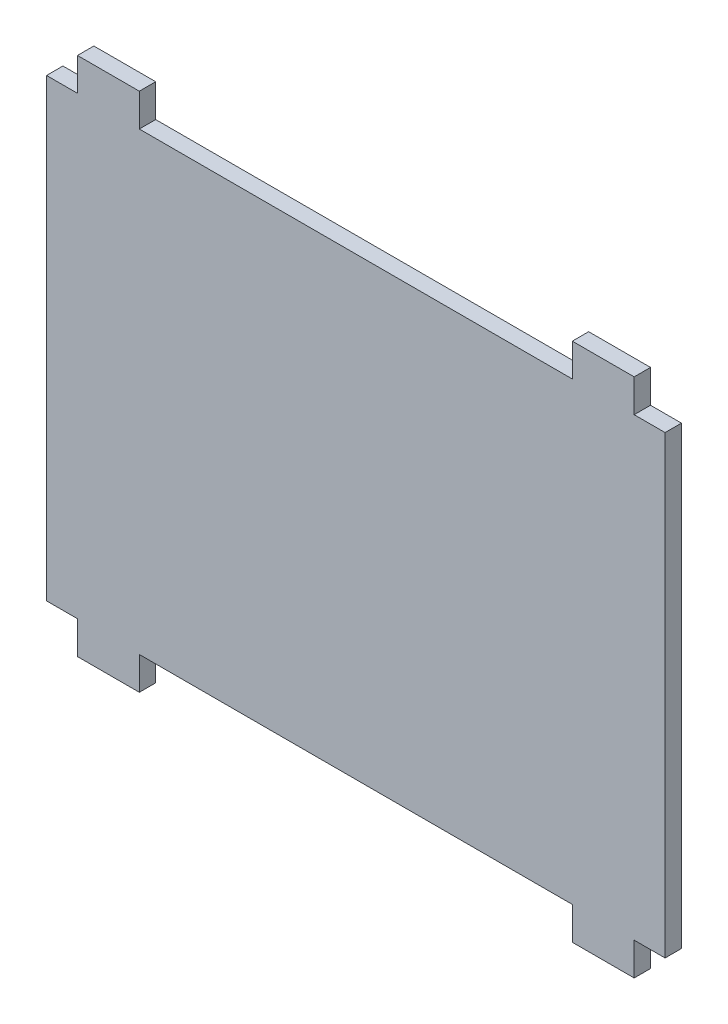
ISO-10303-21;
HEADER;
FILE_DESCRIPTION(('STEP AP214'),'2;1');
FILE_NAME('part.step','',(''),(''),'','','');
FILE_SCHEMA(('AUTOMOTIVE_DESIGN { 1 0 10303 214 1 1 1 1 }'));
ENDSEC;
DATA;
#1=APPLICATION_CONTEXT('core data for automotive mechanical design processes');
#2=APPLICATION_PROTOCOL_DEFINITION('international standard','automotive_design',2000,#1);
#3=PRODUCT_CONTEXT('',#1,'mechanical');
#4=PRODUCT('Part','Part','',(#3));
#5=PRODUCT_RELATED_PRODUCT_CATEGORY('part','',(#4));
#6=PRODUCT_DEFINITION_FORMATION('','',#4);
#7=PRODUCT_DEFINITION_CONTEXT('part definition',#1,'design');
#8=PRODUCT_DEFINITION('design','',#6,#7);
#9=PRODUCT_DEFINITION_SHAPE('','',#8);
#10=(LENGTH_UNIT() NAMED_UNIT(*) SI_UNIT(.MILLI.,.METRE.));
#11=(NAMED_UNIT(*) PLANE_ANGLE_UNIT() SI_UNIT($,.RADIAN.));
#12=(NAMED_UNIT(*) SI_UNIT($,.STERADIAN.) SOLID_ANGLE_UNIT());
#13=UNCERTAINTY_MEASURE_WITH_UNIT(LENGTH_MEASURE(1.E-05),#10,'distance_accuracy_value','');
#14=(GEOMETRIC_REPRESENTATION_CONTEXT(3) GLOBAL_UNCERTAINTY_ASSIGNED_CONTEXT((#13)) GLOBAL_UNIT_ASSIGNED_CONTEXT((#10,
#11,#12)) REPRESENTATION_CONTEXT('',''));
#15=CARTESIAN_POINT('',(0.,0.,0.));
#16=DIRECTION('',(0.,0.,1.));
#17=DIRECTION('',(1.,0.,0.));
#18=AXIS2_PLACEMENT_3D('',#15,#16,#17);
#19=CARTESIAN_POINT('',(-30.,0.,1.5875));
#20=DIRECTION('',(1.,0.,0.));
#21=DIRECTION('',(0.,0.,-1.));
#22=AXIS2_PLACEMENT_3D('',#19,#20,#21);
#23=PLANE('',#22);
#24=DIRECTION('',(0.,0.,-1.));
#25=VECTOR('',#24,1.);
#26=CARTESIAN_POINT('',(-30.,-22.07,1.5875));
#27=LINE('',#26,#25);
#28=CARTESIAN_POINT('',(-30.,-22.07,1.5875));
#29=VERTEX_POINT('',#28);
#30=CARTESIAN_POINT('',(-30.,-22.07,0.));
#31=VERTEX_POINT('',#30);
#32=EDGE_CURVE('E237',#29,#31,#27,.T.);
#33=ORIENTED_EDGE('',*,*,#32,.F.);
#34=DIRECTION('',(0.,-1.,0.));
#35=VECTOR('',#34,1.);
#36=CARTESIAN_POINT('',(-30.,0.,1.5875));
#37=LINE('',#36,#35);
#38=CARTESIAN_POINT('',(-30.,22.07,1.5875));
#39=VERTEX_POINT('',#38);
#40=EDGE_CURVE('E308',#39,#29,#37,.T.);
#41=ORIENTED_EDGE('',*,*,#40,.F.);
#42=DIRECTION('',(0.,0.,-1.));
#43=VECTOR('',#42,1.);
#44=CARTESIAN_POINT('',(-30.,22.07,1.5875));
#45=LINE('',#44,#43);
#46=CARTESIAN_POINT('',(-30.,22.07,0.));
#47=VERTEX_POINT('',#46);
#48=EDGE_CURVE('E304',#39,#47,#45,.T.);
#49=ORIENTED_EDGE('',*,*,#48,.T.);
#50=DIRECTION('',(0.,-1.,0.));
#51=VECTOR('',#50,1.);
#52=CARTESIAN_POINT('',(-30.,0.,0.));
#53=LINE('',#52,#51);
#54=EDGE_CURVE('E307',#47,#31,#53,.T.);
#55=ORIENTED_EDGE('',*,*,#54,.T.);
#56=EDGE_LOOP('',(#33,#41,#49,#55));
#57=FACE_BOUND('',#56,.T.);
#58=ADVANCED_FACE('F37',(#57),#23,.F.);
#59=CARTESIAN_POINT('',(30.,0.,1.5875));
#60=DIRECTION('',(-1.,0.,0.));
#61=DIRECTION('',(0.,0.,1.));
#62=AXIS2_PLACEMENT_3D('',#59,#60,#61);
#63=PLANE('',#62);
#64=DIRECTION('',(0.,0.,1.));
#65=VECTOR('',#64,1.);
#66=CARTESIAN_POINT('',(30.,-22.07,1.5875));
#67=LINE('',#66,#65);
#68=CARTESIAN_POINT('',(30.,-22.07,0.));
#69=VERTEX_POINT('',#68);
#70=CARTESIAN_POINT('',(30.,-22.07,1.5875));
#71=VERTEX_POINT('',#70);
#72=EDGE_CURVE('E230',#69,#71,#67,.T.);
#73=ORIENTED_EDGE('',*,*,#72,.F.);
#74=DIRECTION('',(0.,1.,0.));
#75=VECTOR('',#74,1.);
#76=CARTESIAN_POINT('',(30.,0.,0.));
#77=LINE('',#76,#75);
#78=CARTESIAN_POINT('',(30.,22.07,0.));
#79=VERTEX_POINT('',#78);
#80=EDGE_CURVE('E192',#69,#79,#77,.T.);
#81=ORIENTED_EDGE('',*,*,#80,.T.);
#82=DIRECTION('',(0.,0.,1.));
#83=VECTOR('',#82,1.);
#84=CARTESIAN_POINT('',(30.,22.07,1.5875));
#85=LINE('',#84,#83);
#86=CARTESIAN_POINT('',(30.,22.07,1.5875));
#87=VERTEX_POINT('',#86);
#88=EDGE_CURVE('E295',#79,#87,#85,.T.);
#89=ORIENTED_EDGE('',*,*,#88,.T.);
#90=DIRECTION('',(0.,1.,0.));
#91=VECTOR('',#90,1.);
#92=CARTESIAN_POINT('',(30.,0.,1.5875));
#93=LINE('',#92,#91);
#94=EDGE_CURVE('E311',#71,#87,#93,.T.);
#95=ORIENTED_EDGE('',*,*,#94,.F.);
#96=EDGE_LOOP('',(#73,#81,#89,#95));
#97=FACE_BOUND('',#96,.T.);
#98=ADVANCED_FACE('F350',(#97),#63,.F.);
#99=CARTESIAN_POINT('',(0.,0.,1.5875));
#100=DIRECTION('',(0.,0.,-1.));
#101=DIRECTION('',(-1.,0.,0.));
#102=AXIS2_PLACEMENT_3D('',#99,#100,#101);
#103=PLANE('',#102);
#104=DIRECTION('',(1.,0.,0.));
#105=VECTOR('',#104,1.);
#106=CARTESIAN_POINT('',(-32.8,-22.07,1.5875));
#107=LINE('',#106,#105);
#108=CARTESIAN_POINT('',(-27.,-22.07,1.5875));
#109=VERTEX_POINT('',#108);
#110=EDGE_CURVE('E206',#29,#109,#107,.T.);
#111=ORIENTED_EDGE('',*,*,#110,.T.);
#112=DIRECTION('',(0.,-1.,0.));
#113=VECTOR('',#112,1.);
#114=CARTESIAN_POINT('',(-27.,-25.25,1.5875));
#115=LINE('',#114,#113);
#116=CARTESIAN_POINT('',(-27.,-25.25,1.5875));
#117=VERTEX_POINT('',#116);
#118=EDGE_CURVE('E203',#109,#117,#115,.T.);
#119=ORIENTED_EDGE('',*,*,#118,.T.);
#120=DIRECTION('',(-1.,0.,0.));
#121=VECTOR('',#120,1.);
#122=CARTESIAN_POINT('',(-30.,-25.25,1.5875));
#123=LINE('',#122,#121);
#124=CARTESIAN_POINT('',(-21.,-25.25,1.5875));
#125=VERTEX_POINT('',#124);
#126=EDGE_CURVE('E240',#125,#117,#123,.T.);
#127=ORIENTED_EDGE('',*,*,#126,.F.);
#128=DIRECTION('',(0.,1.,0.));
#129=VECTOR('',#128,1.);
#130=CARTESIAN_POINT('',(-21.,-25.25,1.5875));
#131=LINE('',#130,#129);
#132=CARTESIAN_POINT('',(-21.,-22.07,1.5875));
#133=VERTEX_POINT('',#132);
#134=EDGE_CURVE('E51',#125,#133,#131,.T.);
#135=ORIENTED_EDGE('',*,*,#134,.T.);
#136=DIRECTION('',(1.,0.,0.));
#137=VECTOR('',#136,1.);
#138=CARTESIAN_POINT('',(-21.,-22.07,1.5875));
#139=LINE('',#138,#137);
#140=CARTESIAN_POINT('',(21.,-22.07,1.5875));
#141=VERTEX_POINT('',#140);
#142=EDGE_CURVE('E198',#133,#141,#139,.T.);
#143=ORIENTED_EDGE('',*,*,#142,.T.);
#144=DIRECTION('',(0.,-1.,0.));
#145=VECTOR('',#144,1.);
#146=CARTESIAN_POINT('',(21.,-25.25,1.5875));
#147=LINE('',#146,#145);
#148=CARTESIAN_POINT('',(21.,-25.25,1.5875));
#149=VERTEX_POINT('',#148);
#150=EDGE_CURVE('E217',#141,#149,#147,.T.);
#151=ORIENTED_EDGE('',*,*,#150,.T.);
#152=CARTESIAN_POINT('',(27.,-25.25,1.5875));
#153=VERTEX_POINT('',#152);
#154=EDGE_CURVE('E243',#153,#149,#123,.T.);
#155=ORIENTED_EDGE('',*,*,#154,.F.);
#156=DIRECTION('',(0.,1.,0.));
#157=VECTOR('',#156,1.);
#158=CARTESIAN_POINT('',(27.,-25.25,1.5875));
#159=LINE('',#158,#157);
#160=CARTESIAN_POINT('',(27.,-22.07,1.5875));
#161=VERTEX_POINT('',#160);
#162=EDGE_CURVE('E59',#153,#161,#159,.T.);
#163=ORIENTED_EDGE('',*,*,#162,.T.);
#164=DIRECTION('',(1.,0.,0.));
#165=VECTOR('',#164,1.);
#166=CARTESIAN_POINT('',(27.,-22.07,1.5875));
#167=LINE('',#166,#165);
#168=EDGE_CURVE('E186',#161,#71,#167,.T.);
#169=ORIENTED_EDGE('',*,*,#168,.T.);
#170=ORIENTED_EDGE('',*,*,#94,.T.);
#171=DIRECTION('',(1.,0.,0.));
#172=VECTOR('',#171,1.);
#173=CARTESIAN_POINT('',(27.,22.07,1.5875));
#174=LINE('',#173,#172);
#175=CARTESIAN_POINT('',(27.,22.07,1.5875));
#176=VERTEX_POINT('',#175);
#177=EDGE_CURVE('E254',#176,#87,#174,.T.);
#178=ORIENTED_EDGE('',*,*,#177,.F.);
#179=DIRECTION('',(0.,-1.,0.));
#180=VECTOR('',#179,1.);
#181=CARTESIAN_POINT('',(27.,25.25,1.5875));
#182=LINE('',#181,#180);
#183=CARTESIAN_POINT('',(27.,25.25,1.5875));
#184=VERTEX_POINT('',#183);
#185=EDGE_CURVE('E250',#184,#176,#182,.T.);
#186=ORIENTED_EDGE('',*,*,#185,.F.);
#187=DIRECTION('',(-1.,0.,0.));
#188=VECTOR('',#187,1.);
#189=CARTESIAN_POINT('',(-30.,25.25,1.5875));
#190=LINE('',#189,#188);
#191=CARTESIAN_POINT('',(21.,25.25,1.5875));
#192=VERTEX_POINT('',#191);
#193=EDGE_CURVE('E44',#184,#192,#190,.T.);
#194=ORIENTED_EDGE('',*,*,#193,.T.);
#195=DIRECTION('',(0.,1.,0.));
#196=VECTOR('',#195,1.);
#197=CARTESIAN_POINT('',(21.,25.25,1.5875));
#198=LINE('',#197,#196);
#199=CARTESIAN_POINT('',(21.,22.07,1.5875));
#200=VERTEX_POINT('',#199);
#201=EDGE_CURVE('E289',#200,#192,#198,.T.);
#202=ORIENTED_EDGE('',*,*,#201,.F.);
#203=DIRECTION('',(1.,0.,0.));
#204=VECTOR('',#203,1.);
#205=CARTESIAN_POINT('',(-21.,22.07,1.5875));
#206=LINE('',#205,#204);
#207=CARTESIAN_POINT('',(-21.,22.07,1.5875));
#208=VERTEX_POINT('',#207);
#209=EDGE_CURVE('E262',#208,#200,#206,.T.);
#210=ORIENTED_EDGE('',*,*,#209,.F.);
#211=DIRECTION('',(0.,-1.,0.));
#212=VECTOR('',#211,1.);
#213=CARTESIAN_POINT('',(-21.,25.25,1.5875));
#214=LINE('',#213,#212);
#215=CARTESIAN_POINT('',(-21.,25.25,1.5875));
#216=VERTEX_POINT('',#215);
#217=EDGE_CURVE('E280',#216,#208,#214,.T.);
#218=ORIENTED_EDGE('',*,*,#217,.F.);
#219=CARTESIAN_POINT('',(-27.,25.25,1.5875));
#220=VERTEX_POINT('',#219);
#221=EDGE_CURVE('E314',#216,#220,#190,.T.);
#222=ORIENTED_EDGE('',*,*,#221,.T.);
#223=DIRECTION('',(0.,1.,0.));
#224=VECTOR('',#223,1.);
#225=CARTESIAN_POINT('',(-27.,25.25,1.5875));
#226=LINE('',#225,#224);
#227=CARTESIAN_POINT('',(-27.,22.07,1.5875));
#228=VERTEX_POINT('',#227);
#229=EDGE_CURVE('E268',#228,#220,#226,.T.);
#230=ORIENTED_EDGE('',*,*,#229,.F.);
#231=DIRECTION('',(1.,0.,0.));
#232=VECTOR('',#231,1.);
#233=CARTESIAN_POINT('',(-32.8,22.07,1.5875));
#234=LINE('',#233,#232);
#235=EDGE_CURVE('E269',#39,#228,#234,.T.);
#236=ORIENTED_EDGE('',*,*,#235,.F.);
#237=ORIENTED_EDGE('',*,*,#40,.T.);
#238=EDGE_LOOP('',(#111,#119,#127,#135,#143,#151,#155,#163,#169,#170,#178,#186,#194,#202,#210,
#218,#222,#230,#236,#237));
#239=FACE_BOUND('',#238,.T.);
#240=ADVANCED_FACE('F338',(#239),#103,.F.);
#241=CARTESIAN_POINT('',(0.,0.,0.));
#242=DIRECTION('',(0.,0.,-1.));
#243=DIRECTION('',(-1.,0.,0.));
#244=AXIS2_PLACEMENT_3D('',#241,#242,#243);
#245=PLANE('',#244);
#246=DIRECTION('',(0.,-1.,0.));
#247=VECTOR('',#246,1.);
#248=CARTESIAN_POINT('',(-27.,-25.25,0.));
#249=LINE('',#248,#247);
#250=CARTESIAN_POINT('',(-27.,-22.07,0.));
#251=VERTEX_POINT('',#250);
#252=CARTESIAN_POINT('',(-27.,-25.25,0.));
#253=VERTEX_POINT('',#252);
#254=EDGE_CURVE('E202',#251,#253,#249,.T.);
#255=ORIENTED_EDGE('',*,*,#254,.F.);
#256=DIRECTION('',(1.,0.,0.));
#257=VECTOR('',#256,1.);
#258=CARTESIAN_POINT('',(-32.8,-22.07,0.));
#259=LINE('',#258,#257);
#260=EDGE_CURVE('E200',#31,#251,#259,.T.);
#261=ORIENTED_EDGE('',*,*,#260,.F.);
#262=ORIENTED_EDGE('',*,*,#54,.F.);
#263=DIRECTION('',(-1.,0.,0.));
#264=VECTOR('',#263,1.);
#265=CARTESIAN_POINT('',(0.,22.07,0.));
#266=LINE('',#265,#264);
#267=CARTESIAN_POINT('',(-27.,22.07,0.));
#268=VERTEX_POINT('',#267);
#269=EDGE_CURVE('E11',#268,#47,#266,.T.);
#270=ORIENTED_EDGE('',*,*,#269,.F.);
#271=DIRECTION('',(0.,1.,0.));
#272=VECTOR('',#271,1.);
#273=CARTESIAN_POINT('',(-27.,25.25,0.));
#274=LINE('',#273,#272);
#275=CARTESIAN_POINT('',(-27.,25.25,0.));
#276=VERTEX_POINT('',#275);
#277=EDGE_CURVE('E264',#268,#276,#274,.T.);
#278=ORIENTED_EDGE('',*,*,#277,.T.);
#279=DIRECTION('',(-1.,0.,0.));
#280=VECTOR('',#279,1.);
#281=CARTESIAN_POINT('',(-30.,25.25,0.));
#282=LINE('',#281,#280);
#283=CARTESIAN_POINT('',(-21.,25.25,0.));
#284=VERTEX_POINT('',#283);
#285=EDGE_CURVE('E319',#284,#276,#282,.T.);
#286=ORIENTED_EDGE('',*,*,#285,.F.);
#287=DIRECTION('',(0.,-1.,0.));
#288=VECTOR('',#287,1.);
#289=CARTESIAN_POINT('',(-21.,25.25,0.));
#290=LINE('',#289,#288);
#291=CARTESIAN_POINT('',(-21.,22.07,0.));
#292=VERTEX_POINT('',#291);
#293=EDGE_CURVE('E283',#284,#292,#290,.T.);
#294=ORIENTED_EDGE('',*,*,#293,.T.);
#295=DIRECTION('',(1.,0.,0.));
#296=VECTOR('',#295,1.);
#297=CARTESIAN_POINT('',(-21.,22.07,0.));
#298=LINE('',#297,#296);
#299=CARTESIAN_POINT('',(21.,22.07,0.));
#300=VERTEX_POINT('',#299);
#301=EDGE_CURVE('E276',#292,#300,#298,.T.);
#302=ORIENTED_EDGE('',*,*,#301,.T.);
#303=DIRECTION('',(0.,1.,0.));
#304=VECTOR('',#303,1.);
#305=CARTESIAN_POINT('',(21.,25.25,0.));
#306=LINE('',#305,#304);
#307=CARTESIAN_POINT('',(21.,25.25,0.));
#308=VERTEX_POINT('',#307);
#309=EDGE_CURVE('E279',#300,#308,#306,.T.);
#310=ORIENTED_EDGE('',*,*,#309,.T.);
#311=CARTESIAN_POINT('',(27.,25.25,0.));
#312=VERTEX_POINT('',#311);
#313=EDGE_CURVE('E312',#312,#308,#282,.T.);
#314=ORIENTED_EDGE('',*,*,#313,.F.);
#315=DIRECTION('',(0.,-1.,0.));
#316=VECTOR('',#315,1.);
#317=CARTESIAN_POINT('',(27.,25.25,0.));
#318=LINE('',#317,#316);
#319=CARTESIAN_POINT('',(27.,22.07,0.));
#320=VERTEX_POINT('',#319);
#321=EDGE_CURVE('E249',#312,#320,#318,.T.);
#322=ORIENTED_EDGE('',*,*,#321,.T.);
#323=DIRECTION('',(1.,0.,0.));
#324=VECTOR('',#323,1.);
#325=CARTESIAN_POINT('',(27.,22.07,0.));
#326=LINE('',#325,#324);
#327=EDGE_CURVE('E247',#320,#79,#326,.T.);
#328=ORIENTED_EDGE('',*,*,#327,.T.);
#329=ORIENTED_EDGE('',*,*,#80,.F.);
#330=DIRECTION('',(1.,0.,0.));
#331=VECTOR('',#330,1.);
#332=CARTESIAN_POINT('',(27.,-22.07,0.));
#333=LINE('',#332,#331);
#334=CARTESIAN_POINT('',(27.,-22.07,0.));
#335=VERTEX_POINT('',#334);
#336=EDGE_CURVE('E180',#335,#69,#333,.T.);
#337=ORIENTED_EDGE('',*,*,#336,.F.);
#338=DIRECTION('',(0.,1.,0.));
#339=VECTOR('',#338,1.);
#340=CARTESIAN_POINT('',(27.,-25.25,0.));
#341=LINE('',#340,#339);
#342=CARTESIAN_POINT('',(27.,-25.25,0.));
#343=VERTEX_POINT('',#342);
#344=EDGE_CURVE('E170',#343,#335,#341,.T.);
#345=ORIENTED_EDGE('',*,*,#344,.F.);
#346=DIRECTION('',(-1.,0.,0.));
#347=VECTOR('',#346,1.);
#348=CARTESIAN_POINT('',(-30.,-25.25,0.));
#349=LINE('',#348,#347);
#350=CARTESIAN_POINT('',(21.,-25.25,0.));
#351=VERTEX_POINT('',#350);
#352=EDGE_CURVE('E244',#343,#351,#349,.T.);
#353=ORIENTED_EDGE('',*,*,#352,.T.);
#354=DIRECTION('',(0.,-1.,0.));
#355=VECTOR('',#354,1.);
#356=CARTESIAN_POINT('',(21.,-25.25,0.));
#357=LINE('',#356,#355);
#358=CARTESIAN_POINT('',(21.,-22.07,0.));
#359=VERTEX_POINT('',#358);
#360=EDGE_CURVE('E219',#359,#351,#357,.T.);
#361=ORIENTED_EDGE('',*,*,#360,.F.);
#362=DIRECTION('',(1.,0.,0.));
#363=VECTOR('',#362,1.);
#364=CARTESIAN_POINT('',(-21.,-22.07,0.));
#365=LINE('',#364,#363);
#366=CARTESIAN_POINT('',(-21.,-22.07,0.));
#367=VERTEX_POINT('',#366);
#368=EDGE_CURVE('E214',#367,#359,#365,.T.);
#369=ORIENTED_EDGE('',*,*,#368,.F.);
#370=DIRECTION('',(0.,1.,0.));
#371=VECTOR('',#370,1.);
#372=CARTESIAN_POINT('',(-21.,-25.25,0.));
#373=LINE('',#372,#371);
#374=CARTESIAN_POINT('',(-21.,-25.25,0.));
#375=VERTEX_POINT('',#374);
#376=EDGE_CURVE('E216',#375,#367,#373,.T.);
#377=ORIENTED_EDGE('',*,*,#376,.F.);
#378=EDGE_CURVE('E239',#375,#253,#349,.T.);
#379=ORIENTED_EDGE('',*,*,#378,.T.);
#380=EDGE_LOOP('',(#255,#261,#262,#270,#278,#286,#294,#302,#310,#314,#322,#328,#329,#337,#345,
#353,#361,#369,#377,#379));
#381=FACE_BOUND('',#380,.T.);
#382=ADVANCED_FACE('F190',(#381),#245,.T.);
#383=CARTESIAN_POINT('',(-30.,-25.25,1.5875));
#384=DIRECTION('',(0.,-1.,0.));
#385=DIRECTION('',(0.,0.,-1.));
#386=AXIS2_PLACEMENT_3D('',#383,#384,#385);
#387=PLANE('',#386);
#388=ORIENTED_EDGE('',*,*,#126,.T.);
#389=DIRECTION('',(0.,0.,1.));
#390=VECTOR('',#389,1.);
#391=CARTESIAN_POINT('',(-27.,-25.25,0.));
#392=LINE('',#391,#390);
#393=EDGE_CURVE('E205',#253,#117,#392,.T.);
#394=ORIENTED_EDGE('',*,*,#393,.F.);
#395=ORIENTED_EDGE('',*,*,#378,.F.);
#396=DIRECTION('',(0.,0.,1.));
#397=VECTOR('',#396,1.);
#398=CARTESIAN_POINT('',(-21.,-25.25,0.));
#399=LINE('',#398,#397);
#400=EDGE_CURVE('E233',#375,#125,#399,.T.);
#401=ORIENTED_EDGE('',*,*,#400,.T.);
#402=EDGE_LOOP('',(#388,#394,#395,#401));
#403=FACE_BOUND('',#402,.T.);
#404=ADVANCED_FACE('F369',(#403),#387,.T.);
#405=ORIENTED_EDGE('',*,*,#352,.F.);
#406=DIRECTION('',(0.,0.,1.));
#407=VECTOR('',#406,1.);
#408=CARTESIAN_POINT('',(27.,-25.25,0.));
#409=LINE('',#408,#407);
#410=EDGE_CURVE('E175',#343,#153,#409,.T.);
#411=ORIENTED_EDGE('',*,*,#410,.T.);
#412=ORIENTED_EDGE('',*,*,#154,.T.);
#413=DIRECTION('',(0.,0.,1.));
#414=VECTOR('',#413,1.);
#415=CARTESIAN_POINT('',(21.,-25.25,0.));
#416=LINE('',#415,#414);
#417=EDGE_CURVE('E231',#351,#149,#416,.T.);
#418=ORIENTED_EDGE('',*,*,#417,.F.);
#419=EDGE_LOOP('',(#405,#411,#412,#418));
#420=FACE_BOUND('',#419,.T.);
#421=ADVANCED_FACE('F355',(#420),#387,.T.);
#422=CARTESIAN_POINT('',(-30.,25.25,1.5875));
#423=DIRECTION('',(0.,-1.,0.));
#424=DIRECTION('',(0.,0.,-1.));
#425=AXIS2_PLACEMENT_3D('',#422,#423,#424);
#426=PLANE('',#425);
#427=ORIENTED_EDGE('',*,*,#285,.T.);
#428=DIRECTION('',(0.,0.,1.));
#429=VECTOR('',#428,1.);
#430=CARTESIAN_POINT('',(-27.,25.25,0.));
#431=LINE('',#430,#429);
#432=EDGE_CURVE('E257',#276,#220,#431,.T.);
#433=ORIENTED_EDGE('',*,*,#432,.T.);
#434=ORIENTED_EDGE('',*,*,#221,.F.);
#435=DIRECTION('',(0.,0.,1.));
#436=VECTOR('',#435,1.);
#437=CARTESIAN_POINT('',(-21.,25.25,0.));
#438=LINE('',#437,#436);
#439=EDGE_CURVE('E296',#284,#216,#438,.T.);
#440=ORIENTED_EDGE('',*,*,#439,.F.);
#441=EDGE_LOOP('',(#427,#433,#434,#440));
#442=FACE_BOUND('',#441,.T.);
#443=ADVANCED_FACE('F391',(#442),#426,.F.);
#444=ORIENTED_EDGE('',*,*,#193,.F.);
#445=DIRECTION('',(0.,0.,1.));
#446=VECTOR('',#445,1.);
#447=CARTESIAN_POINT('',(27.,25.25,0.));
#448=LINE('',#447,#446);
#449=EDGE_CURVE('E253',#312,#184,#448,.T.);
#450=ORIENTED_EDGE('',*,*,#449,.F.);
#451=ORIENTED_EDGE('',*,*,#313,.T.);
#452=DIRECTION('',(0.,0.,1.));
#453=VECTOR('',#452,1.);
#454=CARTESIAN_POINT('',(21.,25.25,0.));
#455=LINE('',#454,#453);
#456=EDGE_CURVE('E298',#308,#192,#455,.T.);
#457=ORIENTED_EDGE('',*,*,#456,.T.);
#458=EDGE_LOOP('',(#444,#450,#451,#457));
#459=FACE_BOUND('',#458,.T.);
#460=ADVANCED_FACE('F329',(#459),#426,.F.);
#461=CARTESIAN_POINT('',(-21.,22.07,0.));
#462=DIRECTION('',(0.,-1.,0.));
#463=DIRECTION('',(1.,0.,0.));
#464=AXIS2_PLACEMENT_3D('',#461,#462,#463);
#465=PLANE('',#464);
#466=ORIENTED_EDGE('',*,*,#209,.T.);
#467=DIRECTION('',(0.,0.,1.));
#468=VECTOR('',#467,1.);
#469=CARTESIAN_POINT('',(21.,22.07,0.));
#470=LINE('',#469,#468);
#471=EDGE_CURVE('E286',#300,#200,#470,.T.);
#472=ORIENTED_EDGE('',*,*,#471,.F.);
#473=ORIENTED_EDGE('',*,*,#301,.F.);
#474=DIRECTION('',(0.,0.,1.));
#475=VECTOR('',#474,1.);
#476=CARTESIAN_POINT('',(-21.,22.07,0.));
#477=LINE('',#476,#475);
#478=EDGE_CURVE('E293',#292,#208,#477,.T.);
#479=ORIENTED_EDGE('',*,*,#478,.T.);
#480=EDGE_LOOP('',(#466,#472,#473,#479));
#481=FACE_BOUND('',#480,.T.);
#482=ADVANCED_FACE('F395',(#481),#465,.F.);
#483=CARTESIAN_POINT('',(-21.,25.25,0.));
#484=DIRECTION('',(-1.,0.,0.));
#485=DIRECTION('',(0.,0.,1.));
#486=AXIS2_PLACEMENT_3D('',#483,#484,#485);
#487=PLANE('',#486);
#488=ORIENTED_EDGE('',*,*,#217,.T.);
#489=ORIENTED_EDGE('',*,*,#478,.F.);
#490=ORIENTED_EDGE('',*,*,#293,.F.);
#491=ORIENTED_EDGE('',*,*,#439,.T.);
#492=EDGE_LOOP('',(#488,#489,#490,#491));
#493=FACE_BOUND('',#492,.T.);
#494=ADVANCED_FACE('F393',(#493),#487,.F.);
#495=CARTESIAN_POINT('',(21.,25.25,0.));
#496=DIRECTION('',(1.,0.,0.));
#497=DIRECTION('',(0.,0.,-1.));
#498=AXIS2_PLACEMENT_3D('',#495,#496,#497);
#499=PLANE('',#498);
#500=ORIENTED_EDGE('',*,*,#201,.T.);
#501=ORIENTED_EDGE('',*,*,#456,.F.);
#502=ORIENTED_EDGE('',*,*,#309,.F.);
#503=ORIENTED_EDGE('',*,*,#471,.T.);
#504=EDGE_LOOP('',(#500,#501,#502,#503));
#505=FACE_BOUND('',#504,.T.);
#506=ADVANCED_FACE('F334',(#505),#499,.F.);
#507=CARTESIAN_POINT('',(27.,22.07,0.));
#508=DIRECTION('',(0.,-1.,0.));
#509=DIRECTION('',(0.,0.,-1.));
#510=AXIS2_PLACEMENT_3D('',#507,#508,#509);
#511=PLANE('',#510);
#512=ORIENTED_EDGE('',*,*,#327,.F.);
#513=DIRECTION('',(0.,0.,1.));
#514=VECTOR('',#513,1.);
#515=CARTESIAN_POINT('',(27.,22.07,0.));
#516=LINE('',#515,#514);
#517=EDGE_CURVE('E260',#320,#176,#516,.T.);
#518=ORIENTED_EDGE('',*,*,#517,.T.);
#519=ORIENTED_EDGE('',*,*,#177,.T.);
#520=ORIENTED_EDGE('',*,*,#88,.F.);
#521=EDGE_LOOP('',(#512,#518,#519,#520));
#522=FACE_BOUND('',#521,.T.);
#523=ADVANCED_FACE('F346',(#522),#511,.F.);
#524=CARTESIAN_POINT('',(27.,25.25,0.));
#525=DIRECTION('',(-1.,0.,0.));
#526=DIRECTION('',(0.,0.,1.));
#527=AXIS2_PLACEMENT_3D('',#524,#525,#526);
#528=PLANE('',#527);
#529=ORIENTED_EDGE('',*,*,#185,.T.);
#530=ORIENTED_EDGE('',*,*,#517,.F.);
#531=ORIENTED_EDGE('',*,*,#321,.F.);
#532=ORIENTED_EDGE('',*,*,#449,.T.);
#533=EDGE_LOOP('',(#529,#530,#531,#532));
#534=FACE_BOUND('',#533,.T.);
#535=ADVANCED_FACE('F344',(#534),#528,.F.);
#536=CARTESIAN_POINT('',(-32.8,22.07,0.));
#537=DIRECTION('',(0.,-1.,0.));
#538=DIRECTION('',(0.,0.,-1.));
#539=AXIS2_PLACEMENT_3D('',#536,#537,#538);
#540=PLANE('',#539);
#541=ORIENTED_EDGE('',*,*,#235,.T.);
#542=DIRECTION('',(0.,0.,1.));
#543=VECTOR('',#542,1.);
#544=CARTESIAN_POINT('',(-27.,22.07,0.));
#545=LINE('',#544,#543);
#546=EDGE_CURVE('E267',#268,#228,#545,.T.);
#547=ORIENTED_EDGE('',*,*,#546,.F.);
#548=ORIENTED_EDGE('',*,*,#269,.T.);
#549=ORIENTED_EDGE('',*,*,#48,.F.);
#550=EDGE_LOOP('',(#541,#547,#548,#549));
#551=FACE_BOUND('',#550,.T.);
#552=ADVANCED_FACE('F387',(#551),#540,.F.);
#553=CARTESIAN_POINT('',(-27.,25.25,0.));
#554=DIRECTION('',(1.,0.,0.));
#555=DIRECTION('',(0.,0.,-1.));
#556=AXIS2_PLACEMENT_3D('',#553,#554,#555);
#557=PLANE('',#556);
#558=ORIENTED_EDGE('',*,*,#229,.T.);
#559=ORIENTED_EDGE('',*,*,#432,.F.);
#560=ORIENTED_EDGE('',*,*,#277,.F.);
#561=ORIENTED_EDGE('',*,*,#546,.T.);
#562=EDGE_LOOP('',(#558,#559,#560,#561));
#563=FACE_BOUND('',#562,.T.);
#564=ADVANCED_FACE('F389',(#563),#557,.F.);
#565=CARTESIAN_POINT('',(-21.,-22.07,0.));
#566=DIRECTION('',(0.,-1.,0.));
#567=DIRECTION('',(1.,0.,0.));
#568=AXIS2_PLACEMENT_3D('',#565,#566,#567);
#569=PLANE('',#568);
#570=ORIENTED_EDGE('',*,*,#142,.F.);
#571=DIRECTION('',(0.,0.,1.));
#572=VECTOR('',#571,1.);
#573=CARTESIAN_POINT('',(-21.,-22.07,0.));
#574=LINE('',#573,#572);
#575=EDGE_CURVE('E221',#367,#133,#574,.T.);
#576=ORIENTED_EDGE('',*,*,#575,.F.);
#577=ORIENTED_EDGE('',*,*,#368,.T.);
#578=DIRECTION('',(0.,0.,1.));
#579=VECTOR('',#578,1.);
#580=CARTESIAN_POINT('',(21.,-22.07,0.));
#581=LINE('',#580,#579);
#582=EDGE_CURVE('E227',#359,#141,#581,.T.);
#583=ORIENTED_EDGE('',*,*,#582,.T.);
#584=EDGE_LOOP('',(#570,#576,#577,#583));
#585=FACE_BOUND('',#584,.T.);
#586=ADVANCED_FACE('F364',(#585),#569,.T.);
#587=CARTESIAN_POINT('',(21.,-25.25,0.));
#588=DIRECTION('',(-1.,0.,0.));
#589=DIRECTION('',(0.,0.,1.));
#590=AXIS2_PLACEMENT_3D('',#587,#588,#589);
#591=PLANE('',#590);
#592=ORIENTED_EDGE('',*,*,#150,.F.);
#593=ORIENTED_EDGE('',*,*,#582,.F.);
#594=ORIENTED_EDGE('',*,*,#360,.T.);
#595=ORIENTED_EDGE('',*,*,#417,.T.);
#596=EDGE_LOOP('',(#592,#593,#594,#595));
#597=FACE_BOUND('',#596,.T.);
#598=ADVANCED_FACE('F361',(#597),#591,.T.);
#599=CARTESIAN_POINT('',(-21.,-25.25,0.));
#600=DIRECTION('',(1.,0.,0.));
#601=DIRECTION('',(0.,0.,-1.));
#602=AXIS2_PLACEMENT_3D('',#599,#600,#601);
#603=PLANE('',#602);
#604=ORIENTED_EDGE('',*,*,#134,.F.);
#605=ORIENTED_EDGE('',*,*,#400,.F.);
#606=ORIENTED_EDGE('',*,*,#376,.T.);
#607=ORIENTED_EDGE('',*,*,#575,.T.);
#608=EDGE_LOOP('',(#604,#605,#606,#607));
#609=FACE_BOUND('',#608,.T.);
#610=ADVANCED_FACE('F371',(#609),#603,.T.);
#611=CARTESIAN_POINT('',(27.,-22.07,0.));
#612=DIRECTION('',(0.,-1.,0.));
#613=DIRECTION('',(0.,0.,-1.));
#614=AXIS2_PLACEMENT_3D('',#611,#612,#613);
#615=PLANE('',#614);
#616=ORIENTED_EDGE('',*,*,#72,.T.);
#617=ORIENTED_EDGE('',*,*,#168,.F.);
#618=DIRECTION('',(0.,0.,1.));
#619=VECTOR('',#618,1.);
#620=CARTESIAN_POINT('',(27.,-22.07,0.));
#621=LINE('',#620,#619);
#622=EDGE_CURVE('E173',#335,#161,#621,.T.);
#623=ORIENTED_EDGE('',*,*,#622,.F.);
#624=ORIENTED_EDGE('',*,*,#336,.T.);
#625=EDGE_LOOP('',(#616,#617,#623,#624));
#626=FACE_BOUND('',#625,.T.);
#627=ADVANCED_FACE('F183',(#626),#615,.T.);
#628=CARTESIAN_POINT('',(27.,-25.25,0.));
#629=DIRECTION('',(1.,0.,0.));
#630=DIRECTION('',(0.,0.,-1.));
#631=AXIS2_PLACEMENT_3D('',#628,#629,#630);
#632=PLANE('',#631);
#633=ORIENTED_EDGE('',*,*,#162,.F.);
#634=ORIENTED_EDGE('',*,*,#410,.F.);
#635=ORIENTED_EDGE('',*,*,#344,.T.);
#636=ORIENTED_EDGE('',*,*,#622,.T.);
#637=EDGE_LOOP('',(#633,#634,#635,#636));
#638=FACE_BOUND('',#637,.T.);
#639=ADVANCED_FACE('F172',(#638),#632,.T.);
#640=CARTESIAN_POINT('',(-32.8,-22.07,0.));
#641=DIRECTION('',(0.,-1.,0.));
#642=DIRECTION('',(0.,0.,-1.));
#643=AXIS2_PLACEMENT_3D('',#640,#641,#642);
#644=PLANE('',#643);
#645=ORIENTED_EDGE('',*,*,#32,.T.);
#646=ORIENTED_EDGE('',*,*,#260,.T.);
#647=DIRECTION('',(0.,0.,1.));
#648=VECTOR('',#647,1.);
#649=CARTESIAN_POINT('',(-27.,-22.07,0.));
#650=LINE('',#649,#648);
#651=EDGE_CURVE('E196',#251,#109,#650,.T.);
#652=ORIENTED_EDGE('',*,*,#651,.T.);
#653=ORIENTED_EDGE('',*,*,#110,.F.);
#654=EDGE_LOOP('',(#645,#646,#652,#653));
#655=FACE_BOUND('',#654,.T.);
#656=ADVANCED_FACE('F378',(#655),#644,.T.);
#657=CARTESIAN_POINT('',(-27.,-25.25,0.));
#658=DIRECTION('',(-1.,0.,0.));
#659=DIRECTION('',(0.,0.,1.));
#660=AXIS2_PLACEMENT_3D('',#657,#658,#659);
#661=PLANE('',#660);
#662=ORIENTED_EDGE('',*,*,#118,.F.);
#663=ORIENTED_EDGE('',*,*,#651,.F.);
#664=ORIENTED_EDGE('',*,*,#254,.T.);
#665=ORIENTED_EDGE('',*,*,#393,.T.);
#666=EDGE_LOOP('',(#662,#663,#664,#665));
#667=FACE_BOUND('',#666,.T.);
#668=ADVANCED_FACE('F376',(#667),#661,.T.);
#669=CLOSED_SHELL('',(#58,#98,#240,#382,#404,#421,#443,#460,#482,#494,#506,#523,#535,#552,#564,
#586,#598,#610,#627,#639,#656,#668));
#670=MANIFOLD_SOLID_BREP('B2',#669);
#671=ADVANCED_BREP_SHAPE_REPRESENTATION('',(#18,#670),#14);
#672=SHAPE_DEFINITION_REPRESENTATION(#9,#671);
ENDSEC;
END-ISO-10303-21;
